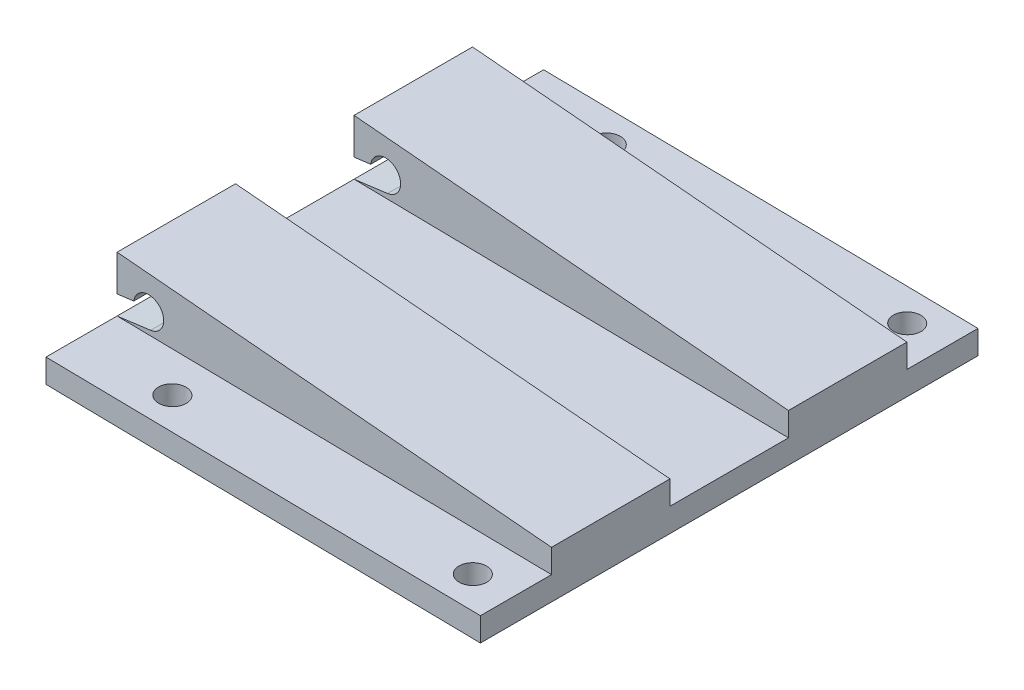
ISO-10303-21;
HEADER;
FILE_DESCRIPTION(('STEP AP214'),'2;1');
FILE_NAME('part.step','',(''),(''),'','','');
FILE_SCHEMA(('AUTOMOTIVE_DESIGN { 1 0 10303 214 1 1 1 1 }'));
ENDSEC;
DATA;
#1=APPLICATION_CONTEXT('core data for automotive mechanical design processes');
#2=APPLICATION_PROTOCOL_DEFINITION('international standard','automotive_design',2000,#1);
#3=PRODUCT_CONTEXT('',#1,'mechanical');
#4=PRODUCT('Part','Part','',(#3));
#5=PRODUCT_RELATED_PRODUCT_CATEGORY('part','',(#4));
#6=PRODUCT_DEFINITION_FORMATION('','',#4);
#7=PRODUCT_DEFINITION_CONTEXT('part definition',#1,'design');
#8=PRODUCT_DEFINITION('design','',#6,#7);
#9=PRODUCT_DEFINITION_SHAPE('','',#8);
#10=(LENGTH_UNIT() NAMED_UNIT(*) SI_UNIT(.MILLI.,.METRE.));
#11=(NAMED_UNIT(*) PLANE_ANGLE_UNIT() SI_UNIT($,.RADIAN.));
#12=(NAMED_UNIT(*) SI_UNIT($,.STERADIAN.) SOLID_ANGLE_UNIT());
#13=UNCERTAINTY_MEASURE_WITH_UNIT(LENGTH_MEASURE(1.E-05),#10,'distance_accuracy_value','');
#14=(GEOMETRIC_REPRESENTATION_CONTEXT(3) GLOBAL_UNCERTAINTY_ASSIGNED_CONTEXT((#13)) GLOBAL_UNIT_ASSIGNED_CONTEXT((#10,
#11,#12)) REPRESENTATION_CONTEXT('',''));
#15=CARTESIAN_POINT('',(0.,0.,0.));
#16=DIRECTION('',(0.,0.,1.));
#17=DIRECTION('',(1.,0.,0.));
#18=AXIS2_PLACEMENT_3D('',#15,#16,#17);
#19=CARTESIAN_POINT('',(0.,10.,63.));
#20=DIRECTION('',(1.,0.,0.));
#21=DIRECTION('',(0.,1.,0.));
#22=AXIS2_PLACEMENT_3D('',#19,#20,#21);
#23=PLANE('',#22);
#24=DIRECTION('',(0.,0.,-1.));
#25=VECTOR('',#24,1.);
#26=CARTESIAN_POINT('',(0.,3.,63.));
#27=LINE('',#26,#25);
#28=CARTESIAN_POINT('',(0.,3.,63.));
#29=VERTEX_POINT('',#28);
#30=CARTESIAN_POINT('',(0.,3.,54.));
#31=VERTEX_POINT('',#30);
#32=EDGE_CURVE('E210',#29,#31,#27,.T.);
#33=ORIENTED_EDGE('',*,*,#32,.T.);
#34=DIRECTION('',(0.,0.,1.));
#35=VECTOR('',#34,1.);
#36=CARTESIAN_POINT('',(0.,3.,0.));
#37=LINE('',#36,#35);
#38=CARTESIAN_POINT('',(0.,3.,39.));
#39=VERTEX_POINT('',#38);
#40=EDGE_CURVE('E331',#39,#31,#37,.T.);
#41=ORIENTED_EDGE('',*,*,#40,.F.);
#42=DIRECTION('',(0.,0.,-1.));
#43=VECTOR('',#42,1.);
#44=CARTESIAN_POINT('',(0.,3.00000000000001,63.));
#45=LINE('',#44,#43);
#46=CARTESIAN_POINT('',(0.,3.,24.));
#47=VERTEX_POINT('',#46);
#48=EDGE_CURVE('E234',#39,#47,#45,.T.);
#49=ORIENTED_EDGE('',*,*,#48,.T.);
#50=CARTESIAN_POINT('',(0.,3.,9.));
#51=VERTEX_POINT('',#50);
#52=EDGE_CURVE('E333',#51,#47,#37,.T.);
#53=ORIENTED_EDGE('',*,*,#52,.F.);
#54=DIRECTION('',(0.,0.,-1.));
#55=VECTOR('',#54,1.);
#56=CARTESIAN_POINT('',(0.,2.99999999999999,63.));
#57=LINE('',#56,#55);
#58=CARTESIAN_POINT('',(0.,3.,0.));
#59=VERTEX_POINT('',#58);
#60=EDGE_CURVE('E204',#51,#59,#57,.T.);
#61=ORIENTED_EDGE('',*,*,#60,.T.);
#62=DIRECTION('',(0.,-1.,0.));
#63=VECTOR('',#62,1.);
#64=CARTESIAN_POINT('',(0.,10.,0.));
#65=LINE('',#64,#63);
#66=CARTESIAN_POINT('',(0.,0.,0.));
#67=VERTEX_POINT('',#66);
#68=EDGE_CURVE('E237',#59,#67,#65,.T.);
#69=ORIENTED_EDGE('',*,*,#68,.T.);
#70=DIRECTION('',(0.,0.,-1.));
#71=VECTOR('',#70,1.);
#72=CARTESIAN_POINT('',(0.,0.,63.));
#73=LINE('',#72,#71);
#74=CARTESIAN_POINT('',(0.,0.,63.));
#75=VERTEX_POINT('',#74);
#76=EDGE_CURVE('E262',#75,#67,#73,.T.);
#77=ORIENTED_EDGE('',*,*,#76,.F.);
#78=DIRECTION('',(0.,-1.,0.));
#79=VECTOR('',#78,1.);
#80=CARTESIAN_POINT('',(0.,10.,63.));
#81=LINE('',#80,#79);
#82=EDGE_CURVE('E238',#29,#75,#81,.T.);
#83=ORIENTED_EDGE('',*,*,#82,.F.);
#84=EDGE_LOOP('',(#33,#41,#49,#53,#61,#69,#77,#83));
#85=FACE_BOUND('',#84,.T.);
#86=ADVANCED_FACE('F34',(#85),#23,.F.);
#87=DIRECTION('',(0.,-1.,0.));
#88=VECTOR('',#87,1.);
#89=CARTESIAN_POINT('',(0.,9.99999999999997,8.99999999999999));
#90=LINE('',#89,#88);
#91=CARTESIAN_POINT('',(0.,10.,8.99999999999999));
#92=VERTEX_POINT('',#91);
#93=CARTESIAN_POINT('',(0.,5.42034944908258,9.));
#94=VERTEX_POINT('',#93);
#95=EDGE_CURVE('E231',#92,#94,#90,.T.);
#96=ORIENTED_EDGE('',*,*,#95,.T.);
#97=DIRECTION('',(0.,0.,1.));
#98=VECTOR('',#97,1.);
#99=CARTESIAN_POINT('',(0.,5.42034944908258,0.));
#100=LINE('',#99,#98);
#101=CARTESIAN_POINT('',(0.,5.42034944908258,24.));
#102=VERTEX_POINT('',#101);
#103=EDGE_CURVE('E330',#94,#102,#100,.T.);
#104=ORIENTED_EDGE('',*,*,#103,.T.);
#105=DIRECTION('',(0.,1.,0.));
#106=VECTOR('',#105,1.);
#107=CARTESIAN_POINT('',(0.,9.99999999999998,24.));
#108=LINE('',#107,#106);
#109=CARTESIAN_POINT('',(0.,10.,24.));
#110=VERTEX_POINT('',#109);
#111=EDGE_CURVE('E216',#102,#110,#108,.T.);
#112=ORIENTED_EDGE('',*,*,#111,.T.);
#113=DIRECTION('',(0.,0.,-1.));
#114=VECTOR('',#113,1.);
#115=CARTESIAN_POINT('',(0.,10.,63.));
#116=LINE('',#115,#114);
#117=EDGE_CURVE('E246',#110,#92,#116,.T.);
#118=ORIENTED_EDGE('',*,*,#117,.T.);
#119=EDGE_LOOP('',(#96,#104,#112,#118));
#120=FACE_BOUND('',#119,.T.);
#121=ADVANCED_FACE('F378',(#120),#23,.F.);
#122=CARTESIAN_POINT('',(55.,5.13965859190033,63.));
#123=DIRECTION('',(-0.0880268014670546,-0.996118106563413,0.));
#124=DIRECTION('',(0.996118106563413,-0.0880268014670546,0.));
#125=AXIS2_PLACEMENT_3D('',#122,#123,#124);
#126=PLANE('',#125);
#127=CARTESIAN_POINT('',(0.,10.,54.));
#128=VERTEX_POINT('',#127);
#129=CARTESIAN_POINT('',(0.,10.,39.));
#130=VERTEX_POINT('',#129);
#131=EDGE_CURVE('E254',#128,#130,#116,.T.);
#132=ORIENTED_EDGE('',*,*,#131,.F.);
#133=DIRECTION('',(0.996118106563413,-0.0880268014670546,0.));
#134=VECTOR('',#133,1.);
#135=CARTESIAN_POINT('',(55.,5.13965859190033,54.));
#136=LINE('',#135,#134);
#137=CARTESIAN_POINT('',(55.,5.13965859190033,54.));
#138=VERTEX_POINT('',#137);
#139=EDGE_CURVE('E276',#128,#138,#136,.T.);
#140=ORIENTED_EDGE('',*,*,#139,.T.);
#141=DIRECTION('',(0.,0.,-1.));
#142=VECTOR('',#141,1.);
#143=CARTESIAN_POINT('',(55.,5.13965859190033,63.));
#144=LINE('',#143,#142);
#145=CARTESIAN_POINT('',(55.,5.13965859190033,39.));
#146=VERTEX_POINT('',#145);
#147=EDGE_CURVE('E258',#138,#146,#144,.T.);
#148=ORIENTED_EDGE('',*,*,#147,.T.);
#149=DIRECTION('',(-0.996118106563413,0.0880268014670546,0.));
#150=VECTOR('',#149,1.);
#151=CARTESIAN_POINT('',(55.,5.13965859190033,39.));
#152=LINE('',#151,#150);
#153=EDGE_CURVE('E273',#146,#130,#152,.T.);
#154=ORIENTED_EDGE('',*,*,#153,.T.);
#155=EDGE_LOOP('',(#132,#140,#148,#154));
#156=FACE_BOUND('',#155,.T.);
#157=ADVANCED_FACE('F361',(#156),#126,.F.);
#158=DIRECTION('',(0.,-1.,0.));
#159=VECTOR('',#158,1.);
#160=CARTESIAN_POINT('',(0.,10.,39.));
#161=LINE('',#160,#159);
#162=CARTESIAN_POINT('',(0.,5.42034944908258,39.));
#163=VERTEX_POINT('',#162);
#164=EDGE_CURVE('E221',#130,#163,#161,.T.);
#165=ORIENTED_EDGE('',*,*,#164,.T.);
#166=CARTESIAN_POINT('',(0.,5.42034944908258,54.));
#167=VERTEX_POINT('',#166);
#168=EDGE_CURVE('E328',#163,#167,#100,.T.);
#169=ORIENTED_EDGE('',*,*,#168,.T.);
#170=DIRECTION('',(0.,1.,0.));
#171=VECTOR('',#170,1.);
#172=CARTESIAN_POINT('',(0.,10.,54.));
#173=LINE('',#172,#171);
#174=EDGE_CURVE('E176',#167,#128,#173,.T.);
#175=ORIENTED_EDGE('',*,*,#174,.T.);
#176=ORIENTED_EDGE('',*,*,#131,.T.);
#177=EDGE_LOOP('',(#165,#169,#175,#176));
#178=FACE_BOUND('',#177,.T.);
#179=ADVANCED_FACE('F36',(#178),#23,.F.);
#180=CARTESIAN_POINT('',(0.,0.,63.));
#181=DIRECTION('',(0.0156406576169155,0.99987767743325,0.));
#182=DIRECTION('',(-0.99987767743325,0.0156406576169155,0.));
#183=AXIS2_PLACEMENT_3D('',#180,#181,#182);
#184=PLANE('',#183);
#185=CARTESIAN_POINT('',(11.9516158959644,-0.186954000890918,4.));
#186=DIRECTION('',(0.0156406576169155,0.99987767743325,0.));
#187=DIRECTION('',(-0.99987767743325,0.0156406576169155,0.));
#188=AXIS2_PLACEMENT_3D('',#185,#186,#187);
#189=CIRCLE('',#188,1.75);
#190=CARTESIAN_POINT('',(10.2018299604562,-0.159582850061316,4.));
#191=VERTEX_POINT('',#190);
#192=EDGE_CURVE('E285',#191,#191,#189,.T.);
#193=ORIENTED_EDGE('',*,*,#192,.T.);
#194=EDGE_LOOP('',(#193));
#195=FACE_BOUND('',#194,.T.);
#196=CARTESIAN_POINT('',(49.9938838716625,-0.782032880845776,4.));
#197=DIRECTION('',(0.0156406576169155,0.99987767743325,0.));
#198=DIRECTION('',(-0.99987767743325,0.0156406576169155,0.));
#199=AXIS2_PLACEMENT_3D('',#196,#197,#198);
#200=CIRCLE('',#199,1.75);
#201=CARTESIAN_POINT('',(48.2440979361543,-0.754661730016174,4.));
#202=VERTEX_POINT('',#201);
#203=EDGE_CURVE('E290',#202,#202,#200,.T.);
#204=ORIENTED_EDGE('',*,*,#203,.T.);
#205=EDGE_LOOP('',(#204));
#206=FACE_BOUND('',#205,.T.);
#207=CARTESIAN_POINT('',(49.9938838716625,-0.782032880845776,59.));
#208=DIRECTION('',(0.0156406576169155,0.99987767743325,0.));
#209=DIRECTION('',(-0.99987767743325,0.0156406576169155,0.));
#210=AXIS2_PLACEMENT_3D('',#207,#208,#209);
#211=CIRCLE('',#210,1.75);
#212=CARTESIAN_POINT('',(48.2440979361543,-0.754661730016174,59.));
#213=VERTEX_POINT('',#212);
#214=EDGE_CURVE('E294',#213,#213,#211,.T.);
#215=ORIENTED_EDGE('',*,*,#214,.T.);
#216=EDGE_LOOP('',(#215));
#217=FACE_BOUND('',#216,.T.);
#218=CARTESIAN_POINT('',(11.9516158959644,-0.186954000890918,59.));
#219=DIRECTION('',(0.0156406576169155,0.99987767743325,0.));
#220=DIRECTION('',(-0.99987767743325,0.0156406576169155,0.));
#221=AXIS2_PLACEMENT_3D('',#218,#219,#220);
#222=CIRCLE('',#221,1.75);
#223=CARTESIAN_POINT('',(10.2018299604562,-0.159582850061316,59.));
#224=VERTEX_POINT('',#223);
#225=EDGE_CURVE('E299',#224,#224,#222,.T.);
#226=ORIENTED_EDGE('',*,*,#225,.T.);
#227=EDGE_LOOP('',(#226));
#228=FACE_BOUND('',#227,.T.);
#229=DIRECTION('',(0.99987767743325,-0.0156406576169155,0.));
#230=VECTOR('',#229,1.);
#231=CARTESIAN_POINT('',(0.,0.,0.));
#232=LINE('',#231,#230);
#233=CARTESIAN_POINT('',(55.,-0.860341408099674,0.));
#234=VERTEX_POINT('',#233);
#235=EDGE_CURVE('E248',#67,#234,#232,.T.);
#236=ORIENTED_EDGE('',*,*,#235,.T.);
#237=DIRECTION('',(0.,0.,-1.));
#238=VECTOR('',#237,1.);
#239=CARTESIAN_POINT('',(55.,-0.860341408099674,63.));
#240=LINE('',#239,#238);
#241=CARTESIAN_POINT('',(55.,-0.860341408099674,63.));
#242=VERTEX_POINT('',#241);
#243=EDGE_CURVE('E259',#242,#234,#240,.T.);
#244=ORIENTED_EDGE('',*,*,#243,.F.);
#245=DIRECTION('',(0.99987767743325,-0.0156406576169155,0.));
#246=VECTOR('',#245,1.);
#247=CARTESIAN_POINT('',(0.,0.,63.));
#248=LINE('',#247,#246);
#249=EDGE_CURVE('E240',#75,#242,#248,.T.);
#250=ORIENTED_EDGE('',*,*,#249,.F.);
#251=ORIENTED_EDGE('',*,*,#76,.T.);
#252=EDGE_LOOP('',(#236,#244,#250,#251));
#253=FACE_BOUND('',#252,.T.);
#254=ADVANCED_FACE('F351',(#195,#206,#217,#228,#253),#184,.F.);
#255=CARTESIAN_POINT('',(55.,-0.860341408099674,63.));
#256=DIRECTION('',(-1.,0.,0.));
#257=DIRECTION('',(0.,-1.,0.));
#258=AXIS2_PLACEMENT_3D('',#255,#256,#257);
#259=PLANE('',#258);
#260=DIRECTION('',(0.,0.,1.));
#261=VECTOR('',#260,1.);
#262=CARTESIAN_POINT('',(55.,2.13965859190032,63.));
#263=LINE('',#262,#261);
#264=CARTESIAN_POINT('',(55.,2.13965859190033,0.));
#265=VERTEX_POINT('',#264);
#266=CARTESIAN_POINT('',(55.,2.13965859190033,9.));
#267=VERTEX_POINT('',#266);
#268=EDGE_CURVE('E193',#265,#267,#263,.T.);
#269=ORIENTED_EDGE('',*,*,#268,.T.);
#270=DIRECTION('',(0.,1.,0.));
#271=VECTOR('',#270,1.);
#272=CARTESIAN_POINT('',(55.,-0.8603414080997,9.));
#273=LINE('',#272,#271);
#274=CARTESIAN_POINT('',(55.,5.13965859190033,8.99999999999999));
#275=VERTEX_POINT('',#274);
#276=EDGE_CURVE('E228',#267,#275,#273,.T.);
#277=ORIENTED_EDGE('',*,*,#276,.T.);
#278=CARTESIAN_POINT('',(55.,5.13965859190033,24.));
#279=VERTEX_POINT('',#278);
#280=EDGE_CURVE('E255',#279,#275,#144,.T.);
#281=ORIENTED_EDGE('',*,*,#280,.F.);
#282=DIRECTION('',(0.,-1.,0.));
#283=VECTOR('',#282,1.);
#284=CARTESIAN_POINT('',(55.,-0.860341408099693,24.));
#285=LINE('',#284,#283);
#286=CARTESIAN_POINT('',(55.,2.13965859190034,24.));
#287=VERTEX_POINT('',#286);
#288=EDGE_CURVE('E213',#279,#287,#285,.T.);
#289=ORIENTED_EDGE('',*,*,#288,.T.);
#290=DIRECTION('',(0.,0.,1.));
#291=VECTOR('',#290,1.);
#292=CARTESIAN_POINT('',(55.,2.13965859190033,63.));
#293=LINE('',#292,#291);
#294=CARTESIAN_POINT('',(55.,2.13965859190033,39.));
#295=VERTEX_POINT('',#294);
#296=EDGE_CURVE('E168',#287,#295,#293,.T.);
#297=ORIENTED_EDGE('',*,*,#296,.T.);
#298=DIRECTION('',(0.,1.,0.));
#299=VECTOR('',#298,1.);
#300=CARTESIAN_POINT('',(55.,-0.86034140809965,39.));
#301=LINE('',#300,#299);
#302=EDGE_CURVE('E218',#295,#146,#301,.T.);
#303=ORIENTED_EDGE('',*,*,#302,.T.);
#304=ORIENTED_EDGE('',*,*,#147,.F.);
#305=DIRECTION('',(0.,-1.,0.));
#306=VECTOR('',#305,1.);
#307=CARTESIAN_POINT('',(55.,-0.860341408099665,54.));
#308=LINE('',#307,#306);
#309=CARTESIAN_POINT('',(55.,2.13965859190033,54.));
#310=VERTEX_POINT('',#309);
#311=EDGE_CURVE('E224',#138,#310,#308,.T.);
#312=ORIENTED_EDGE('',*,*,#311,.T.);
#313=DIRECTION('',(0.,0.,1.));
#314=VECTOR('',#313,1.);
#315=CARTESIAN_POINT('',(55.,2.13965859190033,63.));
#316=LINE('',#315,#314);
#317=CARTESIAN_POINT('',(55.,2.13965859190033,63.));
#318=VERTEX_POINT('',#317);
#319=EDGE_CURVE('E207',#310,#318,#316,.T.);
#320=ORIENTED_EDGE('',*,*,#319,.T.);
#321=DIRECTION('',(0.,1.,0.));
#322=VECTOR('',#321,1.);
#323=CARTESIAN_POINT('',(55.,-0.860341408099674,63.));
#324=LINE('',#323,#322);
#325=EDGE_CURVE('E243',#242,#318,#324,.T.);
#326=ORIENTED_EDGE('',*,*,#325,.F.);
#327=ORIENTED_EDGE('',*,*,#243,.T.);
#328=DIRECTION('',(0.,1.,0.));
#329=VECTOR('',#328,1.);
#330=CARTESIAN_POINT('',(55.,-0.860341408099674,0.));
#331=LINE('',#330,#329);
#332=EDGE_CURVE('E241',#234,#265,#331,.T.);
#333=ORIENTED_EDGE('',*,*,#332,.T.);
#334=EDGE_LOOP('',(#269,#277,#281,#289,#297,#303,#304,#312,#320,#326,#327,#333));
#335=FACE_BOUND('',#334,.T.);
#336=ADVANCED_FACE('F356',(#335),#259,.F.);
#337=ORIENTED_EDGE('',*,*,#280,.T.);
#338=DIRECTION('',(-0.996118106563413,0.0880268014670546,0.));
#339=VECTOR('',#338,1.);
#340=CARTESIAN_POINT('',(55.,5.13965859190033,8.99999999999999));
#341=LINE('',#340,#339);
#342=EDGE_CURVE('E279',#275,#92,#341,.T.);
#343=ORIENTED_EDGE('',*,*,#342,.T.);
#344=ORIENTED_EDGE('',*,*,#117,.F.);
#345=DIRECTION('',(0.996118106563413,-0.0880268014670546,0.));
#346=VECTOR('',#345,1.);
#347=CARTESIAN_POINT('',(55.,5.13965859190033,24.));
#348=LINE('',#347,#346);
#349=EDGE_CURVE('E270',#110,#279,#348,.T.);
#350=ORIENTED_EDGE('',*,*,#349,.T.);
#351=EDGE_LOOP('',(#337,#343,#344,#350));
#352=FACE_BOUND('',#351,.T.);
#353=ADVANCED_FACE('F376',(#352),#126,.F.);
#354=CARTESIAN_POINT('',(0.,0.,63.));
#355=DIRECTION('',(0.,0.,1.));
#356=DIRECTION('',(1.,0.,0.));
#357=AXIS2_PLACEMENT_3D('',#354,#355,#356);
#358=PLANE('',#357);
#359=DIRECTION('',(0.99987767743325,-0.0156406576169155,0.));
#360=VECTOR('',#359,1.);
#361=CARTESIAN_POINT('',(0.0469162332345905,2.99926610948793,63.));
#362=LINE('',#361,#360);
#363=EDGE_CURVE('E268',#29,#318,#362,.T.);
#364=ORIENTED_EDGE('',*,*,#363,.F.);
#365=ORIENTED_EDGE('',*,*,#82,.T.);
#366=ORIENTED_EDGE('',*,*,#249,.T.);
#367=ORIENTED_EDGE('',*,*,#325,.T.);
#368=EDGE_LOOP('',(#364,#365,#366,#367));
#369=FACE_BOUND('',#368,.T.);
#370=ADVANCED_FACE('F348',(#369),#358,.T.);
#371=CARTESIAN_POINT('',(0.,0.,0.));
#372=DIRECTION('',(0.,0.,1.));
#373=DIRECTION('',(1.,0.,0.));
#374=AXIS2_PLACEMENT_3D('',#371,#372,#373);
#375=PLANE('',#374);
#376=ORIENTED_EDGE('',*,*,#68,.F.);
#377=DIRECTION('',(0.99987767743325,-0.0156406576169155,0.));
#378=VECTOR('',#377,1.);
#379=CARTESIAN_POINT('',(0.0469162332345905,2.99926610948793,0.));
#380=LINE('',#379,#378);
#381=EDGE_CURVE('E265',#59,#265,#380,.T.);
#382=ORIENTED_EDGE('',*,*,#381,.T.);
#383=ORIENTED_EDGE('',*,*,#332,.F.);
#384=ORIENTED_EDGE('',*,*,#235,.F.);
#385=EDGE_LOOP('',(#376,#382,#383,#384));
#386=FACE_BOUND('',#385,.T.);
#387=ADVANCED_FACE('F393',(#386),#375,.F.);
#388=CARTESIAN_POINT('',(55.1563874441153,9.13721229019344,9.));
#389=DIRECTION('',(0.,0.,1.));
#390=DIRECTION('',(0.,-1.,0.));
#391=AXIS2_PLACEMENT_3D('',#388,#389,#390);
#392=PLANE('',#391);
#393=DIRECTION('',(-0.99987767743325,0.0156406576169155,0.));
#394=VECTOR('',#393,1.);
#395=CARTESIAN_POINT('',(55.1563874441153,2.13721229019343,9.));
#396=LINE('',#395,#394);
#397=EDGE_CURVE('E190',#267,#51,#396,.T.);
#398=ORIENTED_EDGE('',*,*,#397,.T.);
#399=DIRECTION('',(0.991592350811041,0.129400965270872,0.));
#400=VECTOR('',#399,1.);
#401=CARTESIAN_POINT('',(55.0202994233682,10.1800471726642,9.));
#402=LINE('',#401,#400);
#403=CARTESIAN_POINT('',(4.24586183401466,3.55407710565625,8.99999999999999));
#404=VERTEX_POINT('',#403);
#405=EDGE_CURVE('E310',#51,#404,#402,.T.);
#406=ORIENTED_EDGE('',*,*,#405,.T.);
#407=CARTESIAN_POINT('',(4.,5.43810257219722,8.99999999999999));
#408=DIRECTION('',(0.,0.,1.));
#409=DIRECTION('',(0.,-1.,0.));
#410=AXIS2_PLACEMENT_3D('',#407,#408,#409);
#411=CIRCLE('',#410,1.9);
#412=CARTESIAN_POINT('',(2.11768071491224,5.69670286026109,8.99999999999999));
#413=VERTEX_POINT('',#412);
#414=EDGE_CURVE('E180',#404,#413,#411,.T.);
#415=ORIENTED_EDGE('',*,*,#414,.T.);
#416=DIRECTION('',(-0.991592350811041,-0.129400965270872,0.));
#417=VECTOR('',#416,1.);
#418=CARTESIAN_POINT('',(54.7097371067181,12.5598688146107,9.));
#419=LINE('',#418,#417);
#420=EDGE_CURVE('E49',#413,#94,#419,.T.);
#421=ORIENTED_EDGE('',*,*,#420,.T.);
#422=ORIENTED_EDGE('',*,*,#95,.F.);
#423=ORIENTED_EDGE('',*,*,#342,.F.);
#424=ORIENTED_EDGE('',*,*,#276,.F.);
#425=EDGE_LOOP('',(#398,#406,#415,#421,#422,#423,#424));
#426=FACE_BOUND('',#425,.T.);
#427=ADVANCED_FACE('F386',(#426),#392,.F.);
#428=CARTESIAN_POINT('',(55.1563874441153,2.13721229019343,0.));
#429=DIRECTION('',(-0.0156406576169155,-0.99987767743325,0.));
#430=DIRECTION('',(0.99987767743325,-0.0156406576169155,0.));
#431=AXIS2_PLACEMENT_3D('',#428,#429,#430);
#432=PLANE('',#431);
#433=CARTESIAN_POINT('',(11.998532129199,2.81231210859701,4.));
#434=DIRECTION('',(0.0156406576169155,0.99987767743325,0.));
#435=DIRECTION('',(-0.99987767743325,0.0156406576169155,0.));
#436=AXIS2_PLACEMENT_3D('',#433,#434,#435);
#437=CIRCLE('',#436,1.75);
#438=CARTESIAN_POINT('',(10.2487461936908,2.83968325942662,4.));
#439=VERTEX_POINT('',#438);
#440=EDGE_CURVE('E306',#439,#439,#437,.T.);
#441=ORIENTED_EDGE('',*,*,#440,.F.);
#442=EDGE_LOOP('',(#441));
#443=FACE_BOUND('',#442,.T.);
#444=CARTESIAN_POINT('',(50.0408001048971,2.21723322864216,4.));
#445=DIRECTION('',(0.0156406576169155,0.99987767743325,0.));
#446=DIRECTION('',(-0.99987767743325,0.0156406576169155,0.));
#447=AXIS2_PLACEMENT_3D('',#444,#445,#446);
#448=CIRCLE('',#447,1.75);
#449=CARTESIAN_POINT('',(48.2910141693889,2.24460437947176,4.));
#450=VERTEX_POINT('',#449);
#451=EDGE_CURVE('E309',#450,#450,#448,.T.);
#452=ORIENTED_EDGE('',*,*,#451,.F.);
#453=EDGE_LOOP('',(#452));
#454=FACE_BOUND('',#453,.T.);
#455=ORIENTED_EDGE('',*,*,#397,.F.);
#456=ORIENTED_EDGE('',*,*,#268,.F.);
#457=ORIENTED_EDGE('',*,*,#381,.F.);
#458=ORIENTED_EDGE('',*,*,#60,.F.);
#459=EDGE_LOOP('',(#455,#456,#457,#458));
#460=FACE_BOUND('',#459,.T.);
#461=ADVANCED_FACE('F390',(#443,#454,#460),#432,.F.);
#462=CARTESIAN_POINT('',(55.1563874441153,9.13721229019344,54.));
#463=DIRECTION('',(0.,0.,-1.));
#464=DIRECTION('',(0.,1.,0.));
#465=AXIS2_PLACEMENT_3D('',#462,#463,#464);
#466=PLANE('',#465);
#467=CARTESIAN_POINT('',(4.,5.43810257219723,54.));
#468=DIRECTION('',(0.,0.,-1.));
#469=DIRECTION('',(0.,1.,0.));
#470=AXIS2_PLACEMENT_3D('',#467,#468,#469);
#471=CIRCLE('',#470,1.9);
#472=CARTESIAN_POINT('',(2.11768071491224,5.69670286026109,54.));
#473=VERTEX_POINT('',#472);
#474=CARTESIAN_POINT('',(4.24586183401466,3.55407710565625,54.));
#475=VERTEX_POINT('',#474);
#476=EDGE_CURVE('E174',#473,#475,#471,.T.);
#477=ORIENTED_EDGE('',*,*,#476,.T.);
#478=DIRECTION('',(0.991592350811041,0.129400965270872,0.));
#479=VECTOR('',#478,1.);
#480=CARTESIAN_POINT('',(0.,3.,54.));
#481=LINE('',#480,#479);
#482=EDGE_CURVE('E177',#31,#475,#481,.T.);
#483=ORIENTED_EDGE('',*,*,#482,.F.);
#484=DIRECTION('',(-0.99987767743325,0.0156406576169155,0.));
#485=VECTOR('',#484,1.);
#486=CARTESIAN_POINT('',(55.1563874441153,2.13721229019343,54.));
#487=LINE('',#486,#485);
#488=EDGE_CURVE('E194',#310,#31,#487,.T.);
#489=ORIENTED_EDGE('',*,*,#488,.F.);
#490=ORIENTED_EDGE('',*,*,#311,.F.);
#491=ORIENTED_EDGE('',*,*,#139,.F.);
#492=ORIENTED_EDGE('',*,*,#174,.F.);
#493=DIRECTION('',(-0.991592350811041,-0.129400965270872,0.));
#494=VECTOR('',#493,1.);
#495=CARTESIAN_POINT('',(2.11768071491224,5.69670286026109,54.));
#496=LINE('',#495,#494);
#497=EDGE_CURVE('E160',#473,#167,#496,.T.);
#498=ORIENTED_EDGE('',*,*,#497,.F.);
#499=EDGE_LOOP('',(#477,#483,#489,#490,#491,#492,#498));
#500=FACE_BOUND('',#499,.T.);
#501=ADVANCED_FACE('F172',(#500),#466,.F.);
#502=CARTESIAN_POINT('',(55.1563874441153,2.13721229019343,63.));
#503=DIRECTION('',(-0.0156406576169155,-0.99987767743325,0.));
#504=DIRECTION('',(0.99987767743325,-0.0156406576169155,0.));
#505=AXIS2_PLACEMENT_3D('',#502,#503,#504);
#506=PLANE('',#505);
#507=CARTESIAN_POINT('',(50.0408001048971,2.21723322864215,59.));
#508=DIRECTION('',(0.0156406576169155,0.99987767743325,0.));
#509=DIRECTION('',(-0.99987767743325,0.0156406576169155,0.));
#510=AXIS2_PLACEMENT_3D('',#507,#508,#509);
#511=CIRCLE('',#510,1.75);
#512=CARTESIAN_POINT('',(48.2910141693889,2.24460437947175,59.));
#513=VERTEX_POINT('',#512);
#514=EDGE_CURVE('E305',#513,#513,#511,.T.);
#515=ORIENTED_EDGE('',*,*,#514,.F.);
#516=EDGE_LOOP('',(#515));
#517=FACE_BOUND('',#516,.T.);
#518=CARTESIAN_POINT('',(11.998532129199,2.81231210859701,59.));
#519=DIRECTION('',(0.0156406576169155,0.99987767743325,0.));
#520=DIRECTION('',(-0.99987767743325,0.0156406576169155,0.));
#521=AXIS2_PLACEMENT_3D('',#518,#519,#520);
#522=CIRCLE('',#521,1.75);
#523=CARTESIAN_POINT('',(10.2487461936908,2.83968325942661,59.));
#524=VERTEX_POINT('',#523);
#525=EDGE_CURVE('E302',#524,#524,#522,.T.);
#526=ORIENTED_EDGE('',*,*,#525,.F.);
#527=EDGE_LOOP('',(#526));
#528=FACE_BOUND('',#527,.T.);
#529=ORIENTED_EDGE('',*,*,#363,.T.);
#530=ORIENTED_EDGE('',*,*,#319,.F.);
#531=ORIENTED_EDGE('',*,*,#488,.T.);
#532=ORIENTED_EDGE('',*,*,#32,.F.);
#533=EDGE_LOOP('',(#529,#530,#531,#532));
#534=FACE_BOUND('',#533,.T.);
#535=ADVANCED_FACE('F340',(#517,#528,#534),#506,.F.);
#536=CARTESIAN_POINT('',(55.1563874441153,2.13721229019344,24.));
#537=DIRECTION('',(-0.0156406576169155,-0.99987767743325,0.));
#538=DIRECTION('',(0.99987767743325,-0.0156406576169155,0.));
#539=AXIS2_PLACEMENT_3D('',#536,#537,#538);
#540=PLANE('',#539);
#541=DIRECTION('',(-0.99987767743325,0.0156406576169155,0.));
#542=VECTOR('',#541,1.);
#543=CARTESIAN_POINT('',(55.1563874441153,2.13721229019344,39.));
#544=LINE('',#543,#542);
#545=EDGE_CURVE('E197',#295,#39,#544,.T.);
#546=ORIENTED_EDGE('',*,*,#545,.F.);
#547=ORIENTED_EDGE('',*,*,#296,.F.);
#548=DIRECTION('',(-0.99987767743325,0.0156406576169155,0.));
#549=VECTOR('',#548,1.);
#550=CARTESIAN_POINT('',(55.1563874441153,2.13721229019344,24.));
#551=LINE('',#550,#549);
#552=EDGE_CURVE('E184',#287,#47,#551,.T.);
#553=ORIENTED_EDGE('',*,*,#552,.T.);
#554=ORIENTED_EDGE('',*,*,#48,.F.);
#555=EDGE_LOOP('',(#546,#547,#553,#554));
#556=FACE_BOUND('',#555,.T.);
#557=ADVANCED_FACE('F368',(#556),#540,.F.);
#558=CARTESIAN_POINT('',(55.1563874441153,2.13721229019344,39.));
#559=DIRECTION('',(0.,0.,1.));
#560=DIRECTION('',(0.,-1.,0.));
#561=AXIS2_PLACEMENT_3D('',#558,#559,#560);
#562=PLANE('',#561);
#563=ORIENTED_EDGE('',*,*,#545,.T.);
#564=DIRECTION('',(0.991592350811041,0.129400965270872,0.));
#565=VECTOR('',#564,1.);
#566=CARTESIAN_POINT('',(54.1221083719171,10.062834903973,39.));
#567=LINE('',#566,#565);
#568=CARTESIAN_POINT('',(4.24586183401466,3.55407710565625,39.));
#569=VERTEX_POINT('',#568);
#570=EDGE_CURVE('E317',#39,#569,#567,.T.);
#571=ORIENTED_EDGE('',*,*,#570,.T.);
#572=CARTESIAN_POINT('',(4.,5.43810257219722,39.));
#573=DIRECTION('',(0.,0.,1.));
#574=DIRECTION('',(0.,-1.,0.));
#575=AXIS2_PLACEMENT_3D('',#572,#573,#574);
#576=CIRCLE('',#575,1.9);
#577=CARTESIAN_POINT('',(2.11768071491224,5.69670286026109,39.));
#578=VERTEX_POINT('',#577);
#579=EDGE_CURVE('E181',#569,#578,#576,.T.);
#580=ORIENTED_EDGE('',*,*,#579,.T.);
#581=DIRECTION('',(-0.991592350811041,-0.129400965270872,0.));
#582=VECTOR('',#581,1.);
#583=CARTESIAN_POINT('',(53.811546055267,12.4426565459195,39.));
#584=LINE('',#583,#582);
#585=EDGE_CURVE('E163',#578,#163,#584,.T.);
#586=ORIENTED_EDGE('',*,*,#585,.T.);
#587=ORIENTED_EDGE('',*,*,#164,.F.);
#588=ORIENTED_EDGE('',*,*,#153,.F.);
#589=ORIENTED_EDGE('',*,*,#302,.F.);
#590=EDGE_LOOP('',(#563,#571,#580,#586,#587,#588,#589));
#591=FACE_BOUND('',#590,.T.);
#592=ADVANCED_FACE('F365',(#591),#562,.F.);
#593=CARTESIAN_POINT('',(55.1563874441153,9.13721229019344,24.));
#594=DIRECTION('',(0.,0.,-1.));
#595=DIRECTION('',(0.,1.,0.));
#596=AXIS2_PLACEMENT_3D('',#593,#594,#595);
#597=PLANE('',#596);
#598=CARTESIAN_POINT('',(4.,5.43810257219722,24.));
#599=DIRECTION('',(0.,0.,-1.));
#600=DIRECTION('',(0.,1.,0.));
#601=AXIS2_PLACEMENT_3D('',#598,#599,#600);
#602=CIRCLE('',#601,1.9);
#603=CARTESIAN_POINT('',(2.11768071491224,5.69670286026109,24.));
#604=VERTEX_POINT('',#603);
#605=CARTESIAN_POINT('',(4.24586183401466,3.55407710565624,24.));
#606=VERTEX_POINT('',#605);
#607=EDGE_CURVE('E186',#604,#606,#602,.T.);
#608=ORIENTED_EDGE('',*,*,#607,.T.);
#609=DIRECTION('',(-0.991592350811041,-0.129400965270872,0.));
#610=VECTOR('',#609,1.);
#611=CARTESIAN_POINT('',(55.0202994233682,10.1800471726642,24.));
#612=LINE('',#611,#610);
#613=EDGE_CURVE('E57',#606,#47,#612,.T.);
#614=ORIENTED_EDGE('',*,*,#613,.T.);
#615=ORIENTED_EDGE('',*,*,#552,.F.);
#616=ORIENTED_EDGE('',*,*,#288,.F.);
#617=ORIENTED_EDGE('',*,*,#349,.F.);
#618=ORIENTED_EDGE('',*,*,#111,.F.);
#619=DIRECTION('',(0.991592350811041,0.129400965270872,0.));
#620=VECTOR('',#619,1.);
#621=CARTESIAN_POINT('',(54.7097371067181,12.5598688146107,24.));
#622=LINE('',#621,#620);
#623=EDGE_CURVE('E323',#102,#604,#622,.T.);
#624=ORIENTED_EDGE('',*,*,#623,.T.);
#625=EDGE_LOOP('',(#608,#614,#615,#616,#617,#618,#624));
#626=FACE_BOUND('',#625,.T.);
#627=ADVANCED_FACE('F372',(#626),#597,.F.);
#628=CARTESIAN_POINT('',(4.,5.43810257219723,63.));
#629=DIRECTION('',(0.,0.,-1.));
#630=DIRECTION('',(0.,1.,0.));
#631=AXIS2_PLACEMENT_3D('',#628,#629,#630);
#632=CYLINDRICAL_SURFACE('',#631,1.9);
#633=ORIENTED_EDGE('',*,*,#414,.F.);
#634=DIRECTION('',(0.,0.,1.));
#635=VECTOR('',#634,1.);
#636=CARTESIAN_POINT('',(4.24586183401466,3.55407710565625,0.));
#637=LINE('',#636,#635);
#638=EDGE_CURVE('E325',#404,#606,#637,.T.);
#639=ORIENTED_EDGE('',*,*,#638,.T.);
#640=ORIENTED_EDGE('',*,*,#607,.F.);
#641=DIRECTION('',(0.,0.,1.));
#642=VECTOR('',#641,1.);
#643=CARTESIAN_POINT('',(2.11768071491224,5.69670286026109,0.));
#644=LINE('',#643,#642);
#645=EDGE_CURVE('E326',#413,#604,#644,.T.);
#646=ORIENTED_EDGE('',*,*,#645,.F.);
#647=EDGE_LOOP('',(#633,#639,#640,#646));
#648=FACE_BOUND('',#647,.T.);
#649=ADVANCED_FACE('F382',(#648),#632,.F.);
#650=ORIENTED_EDGE('',*,*,#579,.F.);
#651=DIRECTION('',(0.,0.,-1.));
#652=VECTOR('',#651,1.);
#653=CARTESIAN_POINT('',(4.24586183401466,3.55407710565625,63.));
#654=LINE('',#653,#652);
#655=EDGE_CURVE('E11',#569,#475,#654,.F.);
#656=ORIENTED_EDGE('',*,*,#655,.T.);
#657=ORIENTED_EDGE('',*,*,#476,.F.);
#658=DIRECTION('',(0.,0.,-1.));
#659=VECTOR('',#658,1.);
#660=CARTESIAN_POINT('',(2.11768071491224,5.69670286026109,63.));
#661=LINE('',#660,#659);
#662=EDGE_CURVE('E42',#473,#578,#661,.T.);
#663=ORIENTED_EDGE('',*,*,#662,.T.);
#664=EDGE_LOOP('',(#650,#656,#657,#663));
#665=FACE_BOUND('',#664,.T.);
#666=ADVANCED_FACE('F179',(#665),#632,.F.);
#667=CARTESIAN_POINT('',(11.9381612365765,-1.04708494352508,59.));
#668=DIRECTION('',(0.0156406576169155,0.99987767743325,0.));
#669=DIRECTION('',(-0.99987767743325,0.0156406576169155,0.));
#670=AXIS2_PLACEMENT_3D('',#667,#668,#669);
#671=CYLINDRICAL_SURFACE('',#670,1.75);
#672=ORIENTED_EDGE('',*,*,#525,.T.);
#673=EDGE_LOOP('',(#672));
#674=FACE_BOUND('',#673,.T.);
#675=ORIENTED_EDGE('',*,*,#225,.F.);
#676=EDGE_LOOP('',(#675));
#677=FACE_BOUND('',#676,.T.);
#678=ADVANCED_FACE('F434',(#674,#677),#671,.F.);
#679=CARTESIAN_POINT('',(49.9804292122746,-1.64216382347994,59.));
#680=DIRECTION('',(0.0156406576169155,0.99987767743325,0.));
#681=DIRECTION('',(-0.99987767743325,0.0156406576169155,0.));
#682=AXIS2_PLACEMENT_3D('',#679,#680,#681);
#683=CYLINDRICAL_SURFACE('',#682,1.75);
#684=ORIENTED_EDGE('',*,*,#514,.T.);
#685=EDGE_LOOP('',(#684));
#686=FACE_BOUND('',#685,.T.);
#687=ORIENTED_EDGE('',*,*,#214,.F.);
#688=EDGE_LOOP('',(#687));
#689=FACE_BOUND('',#688,.T.);
#690=ADVANCED_FACE('F439',(#686,#689),#683,.F.);
#691=CARTESIAN_POINT('',(49.9804292122746,-1.64216382347994,4.));
#692=DIRECTION('',(0.0156406576169155,0.99987767743325,0.));
#693=DIRECTION('',(-0.99987767743325,0.0156406576169155,0.));
#694=AXIS2_PLACEMENT_3D('',#691,#692,#693);
#695=CYLINDRICAL_SURFACE('',#694,1.75);
#696=ORIENTED_EDGE('',*,*,#451,.T.);
#697=EDGE_LOOP('',(#696));
#698=FACE_BOUND('',#697,.T.);
#699=ORIENTED_EDGE('',*,*,#203,.F.);
#700=EDGE_LOOP('',(#699));
#701=FACE_BOUND('',#700,.T.);
#702=ADVANCED_FACE('F451',(#698,#701),#695,.F.);
#703=CARTESIAN_POINT('',(11.9381612365765,-1.04708494352508,4.));
#704=DIRECTION('',(0.0156406576169155,0.99987767743325,0.));
#705=DIRECTION('',(-0.99987767743325,0.0156406576169155,0.));
#706=AXIS2_PLACEMENT_3D('',#703,#704,#705);
#707=CYLINDRICAL_SURFACE('',#706,1.75);
#708=ORIENTED_EDGE('',*,*,#440,.T.);
#709=EDGE_LOOP('',(#708));
#710=FACE_BOUND('',#709,.T.);
#711=ORIENTED_EDGE('',*,*,#192,.F.);
#712=EDGE_LOOP('',(#711));
#713=FACE_BOUND('',#712,.T.);
#714=ADVANCED_FACE('F461',(#710,#713),#707,.F.);
#715=CARTESIAN_POINT('',(2.11768071491224,5.69670286026109,0.));
#716=DIRECTION('',(-0.129400965270872,0.991592350811041,0.));
#717=DIRECTION('',(-0.991592350811041,-0.129400965270872,0.));
#718=AXIS2_PLACEMENT_3D('',#715,#716,#717);
#719=PLANE('',#718);
#720=ORIENTED_EDGE('',*,*,#662,.F.);
#721=ORIENTED_EDGE('',*,*,#497,.T.);
#722=ORIENTED_EDGE('',*,*,#168,.F.);
#723=ORIENTED_EDGE('',*,*,#585,.F.);
#724=EDGE_LOOP('',(#720,#721,#722,#723));
#725=FACE_BOUND('',#724,.T.);
#726=ADVANCED_FACE('F159',(#725),#719,.F.);
#727=CARTESIAN_POINT('',(0.,3.,0.));
#728=DIRECTION('',(0.129400965270872,-0.991592350811041,0.));
#729=DIRECTION('',(0.991592350811041,0.129400965270872,0.));
#730=AXIS2_PLACEMENT_3D('',#727,#728,#729);
#731=PLANE('',#730);
#732=ORIENTED_EDGE('',*,*,#40,.T.);
#733=ORIENTED_EDGE('',*,*,#482,.T.);
#734=ORIENTED_EDGE('',*,*,#655,.F.);
#735=ORIENTED_EDGE('',*,*,#570,.F.);
#736=EDGE_LOOP('',(#732,#733,#734,#735));
#737=FACE_BOUND('',#736,.T.);
#738=ADVANCED_FACE('F336',(#737),#731,.F.);
#739=ORIENTED_EDGE('',*,*,#645,.T.);
#740=ORIENTED_EDGE('',*,*,#623,.F.);
#741=ORIENTED_EDGE('',*,*,#103,.F.);
#742=ORIENTED_EDGE('',*,*,#420,.F.);
#743=EDGE_LOOP('',(#739,#740,#741,#742));
#744=FACE_BOUND('',#743,.T.);
#745=ADVANCED_FACE('F564',(#744),#719,.F.);
#746=ORIENTED_EDGE('',*,*,#52,.T.);
#747=ORIENTED_EDGE('',*,*,#613,.F.);
#748=ORIENTED_EDGE('',*,*,#638,.F.);
#749=ORIENTED_EDGE('',*,*,#405,.F.);
#750=EDGE_LOOP('',(#746,#747,#748,#749));
#751=FACE_BOUND('',#750,.T.);
#752=ADVANCED_FACE('F383',(#751),#731,.F.);
#753=CLOSED_SHELL('',(#86,#121,#157,#179,#254,#336,#353,#370,#387,#427,#461,#501,#535,#557,#592,
#627,#649,#666,#678,#690,#702,#714,#726,#738,#745,#752));
#754=MANIFOLD_SOLID_BREP('B2',#753);
#755=ADVANCED_BREP_SHAPE_REPRESENTATION('',(#18,#754),#14);
#756=SHAPE_DEFINITION_REPRESENTATION(#9,#755);
ENDSEC;
END-ISO-10303-21;
